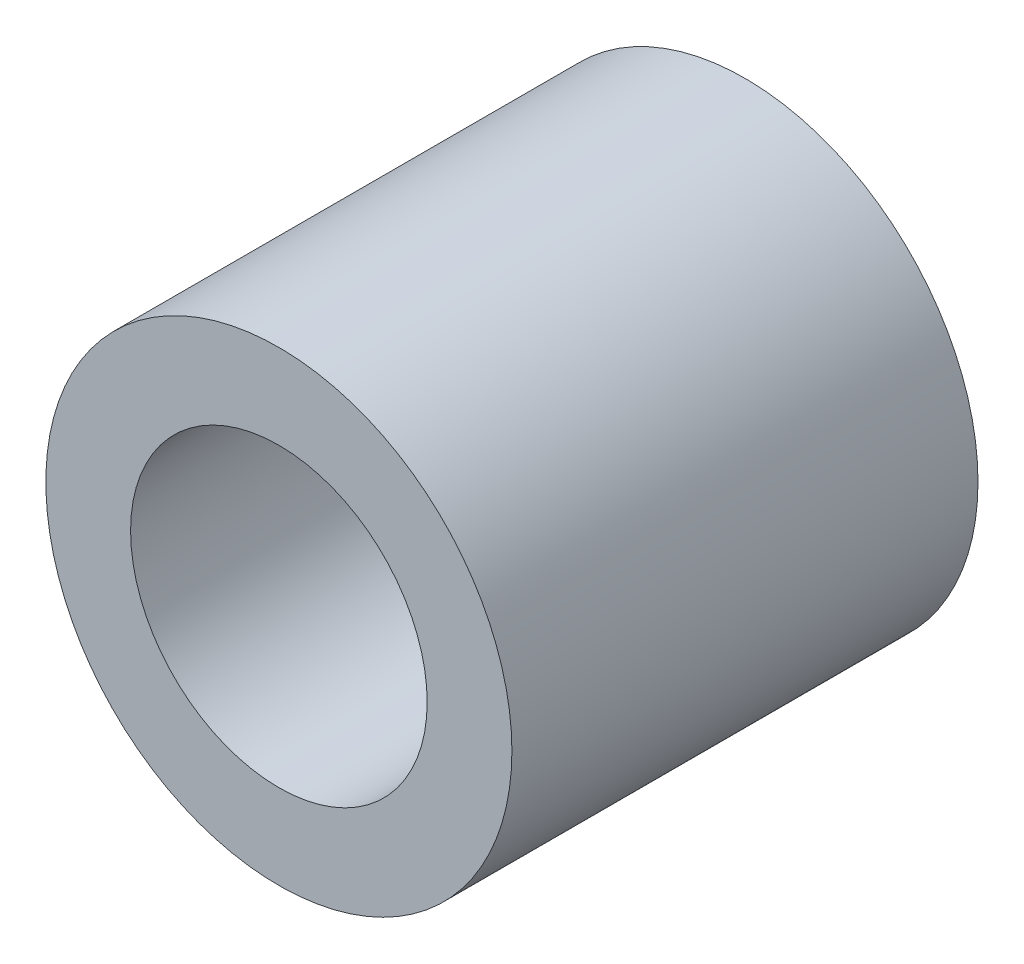
ISO-10303-21;
HEADER;
FILE_DESCRIPTION(('STEP AP214'),'2;1');
FILE_NAME('part.step','',(''),(''),'','','');
FILE_SCHEMA(('AUTOMOTIVE_DESIGN { 1 0 10303 214 1 1 1 1 }'));
ENDSEC;
DATA;
#1=APPLICATION_CONTEXT('core data for automotive mechanical design processes');
#2=APPLICATION_PROTOCOL_DEFINITION('international standard','automotive_design',2000,#1);
#3=PRODUCT_CONTEXT('',#1,'mechanical');
#4=PRODUCT('Part','Part','',(#3));
#5=PRODUCT_RELATED_PRODUCT_CATEGORY('part','',(#4));
#6=PRODUCT_DEFINITION_FORMATION('','',#4);
#7=PRODUCT_DEFINITION_CONTEXT('part definition',#1,'design');
#8=PRODUCT_DEFINITION('design','',#6,#7);
#9=PRODUCT_DEFINITION_SHAPE('','',#8);
#10=(LENGTH_UNIT() NAMED_UNIT(*) SI_UNIT(.MILLI.,.METRE.));
#11=(NAMED_UNIT(*) PLANE_ANGLE_UNIT() SI_UNIT($,.RADIAN.));
#12=(NAMED_UNIT(*) SI_UNIT($,.STERADIAN.) SOLID_ANGLE_UNIT());
#13=UNCERTAINTY_MEASURE_WITH_UNIT(LENGTH_MEASURE(1.E-05),#10,'distance_accuracy_value','');
#14=(GEOMETRIC_REPRESENTATION_CONTEXT(3) GLOBAL_UNCERTAINTY_ASSIGNED_CONTEXT((#13)) GLOBAL_UNIT_ASSIGNED_CONTEXT((#10,
#11,#12)) REPRESENTATION_CONTEXT('',''));
#15=CARTESIAN_POINT('',(0.,0.,0.));
#16=DIRECTION('',(0.,0.,1.));
#17=DIRECTION('',(1.,0.,0.));
#18=AXIS2_PLACEMENT_3D('',#15,#16,#17);
#19=CARTESIAN_POINT('',(0.,0.,5.5));
#20=DIRECTION('',(0.,0.,1.));
#21=DIRECTION('',(1.,0.,0.));
#22=AXIS2_PLACEMENT_3D('',#19,#20,#21);
#23=PLANE('',#22);
#24=CARTESIAN_POINT('',(0.,0.,5.5));
#25=DIRECTION('',(0.,0.,1.));
#26=DIRECTION('',(1.,0.,0.));
#27=AXIS2_PLACEMENT_3D('',#24,#25,#26);
#28=CIRCLE('',#27,2.75);
#29=CARTESIAN_POINT('',(2.75,0.,5.5));
#30=VERTEX_POINT('',#29);
#31=EDGE_CURVE('E10',#30,#30,#28,.T.);
#32=ORIENTED_EDGE('',*,*,#31,.T.);
#33=EDGE_LOOP('',(#32));
#34=FACE_BOUND('',#33,.T.);
#35=CARTESIAN_POINT('',(0.,0.,5.5));
#36=DIRECTION('',(0.,0.,1.));
#37=DIRECTION('',(1.,0.,0.));
#38=AXIS2_PLACEMENT_3D('',#35,#36,#37);
#39=CIRCLE('',#38,1.75);
#40=CARTESIAN_POINT('',(1.75,0.,5.5));
#41=VERTEX_POINT('',#40);
#42=EDGE_CURVE('E56',#41,#41,#39,.T.);
#43=ORIENTED_EDGE('',*,*,#42,.F.);
#44=EDGE_LOOP('',(#43));
#45=FACE_BOUND('',#44,.T.);
#46=ADVANCED_FACE('F43',(#34,#45),#23,.T.);
#47=CARTESIAN_POINT('',(0.,0.,0.));
#48=DIRECTION('',(0.,0.,1.));
#49=DIRECTION('',(1.,0.,0.));
#50=AXIS2_PLACEMENT_3D('',#47,#48,#49);
#51=PLANE('',#50);
#52=CARTESIAN_POINT('',(0.,0.,0.));
#53=DIRECTION('',(0.,0.,1.));
#54=DIRECTION('',(1.,0.,0.));
#55=AXIS2_PLACEMENT_3D('',#52,#53,#54);
#56=CIRCLE('',#55,2.75);
#57=CARTESIAN_POINT('',(2.75,0.,0.));
#58=VERTEX_POINT('',#57);
#59=EDGE_CURVE('E47',#58,#58,#56,.T.);
#60=ORIENTED_EDGE('',*,*,#59,.F.);
#61=EDGE_LOOP('',(#60));
#62=FACE_BOUND('',#61,.T.);
#63=CARTESIAN_POINT('',(0.,0.,0.));
#64=DIRECTION('',(0.,0.,1.));
#65=DIRECTION('',(1.,0.,0.));
#66=AXIS2_PLACEMENT_3D('',#63,#64,#65);
#67=CIRCLE('',#66,1.75);
#68=CARTESIAN_POINT('',(1.75,0.,0.));
#69=VERTEX_POINT('',#68);
#70=EDGE_CURVE('E58',#69,#69,#67,.T.);
#71=ORIENTED_EDGE('',*,*,#70,.T.);
#72=EDGE_LOOP('',(#71));
#73=FACE_BOUND('',#72,.T.);
#74=ADVANCED_FACE('F70',(#62,#73),#51,.F.);
#75=CARTESIAN_POINT('',(0.,0.,5.5));
#76=DIRECTION('',(0.,0.,-1.));
#77=DIRECTION('',(-1.,0.,0.));
#78=AXIS2_PLACEMENT_3D('',#75,#76,#77);
#79=CYLINDRICAL_SURFACE('',#78,2.75);
#80=ORIENTED_EDGE('',*,*,#31,.F.);
#81=EDGE_LOOP('',(#80));
#82=FACE_BOUND('',#81,.T.);
#83=ORIENTED_EDGE('',*,*,#59,.T.);
#84=EDGE_LOOP('',(#83));
#85=FACE_BOUND('',#84,.T.);
#86=ADVANCED_FACE('F45',(#82,#85),#79,.T.);
#87=CARTESIAN_POINT('',(0.,0.,5.5));
#88=DIRECTION('',(0.,0.,-1.));
#89=DIRECTION('',(-1.,0.,0.));
#90=AXIS2_PLACEMENT_3D('',#87,#88,#89);
#91=CYLINDRICAL_SURFACE('',#90,1.75);
#92=ORIENTED_EDGE('',*,*,#42,.T.);
#93=EDGE_LOOP('',(#92));
#94=FACE_BOUND('',#93,.T.);
#95=ORIENTED_EDGE('',*,*,#70,.F.);
#96=EDGE_LOOP('',(#95));
#97=FACE_BOUND('',#96,.T.);
#98=ADVANCED_FACE('F66',(#94,#97),#91,.F.);
#99=CLOSED_SHELL('',(#46,#74,#86,#98));
#100=MANIFOLD_SOLID_BREP('B2',#99);
#101=ADVANCED_BREP_SHAPE_REPRESENTATION('',(#18,#100),#14);
#102=SHAPE_DEFINITION_REPRESENTATION(#9,#101);
ENDSEC;
END-ISO-10303-21;
